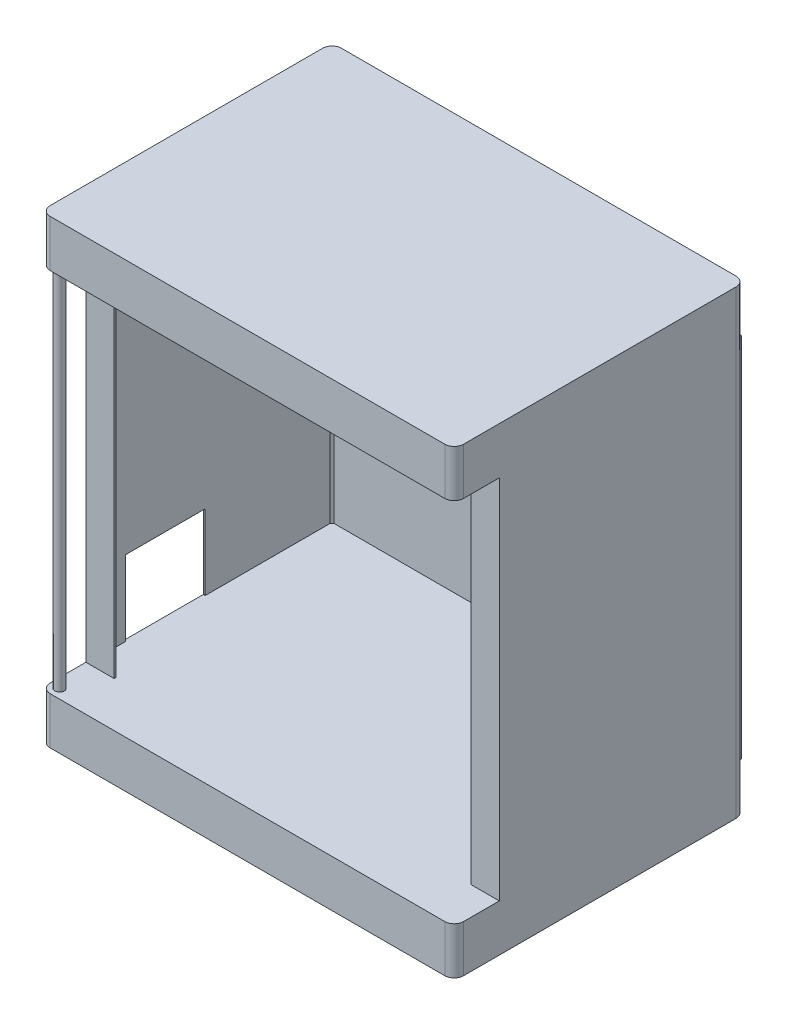
ISO-10303-21;
HEADER;
FILE_DESCRIPTION(('STEP AP214'),'2;1');
FILE_NAME('part.step','',(''),(''),'','','');
FILE_SCHEMA(('AUTOMOTIVE_DESIGN { 1 0 10303 214 1 1 1 1 }'));
ENDSEC;
DATA;
#1=APPLICATION_CONTEXT('core data for automotive mechanical design processes');
#2=APPLICATION_PROTOCOL_DEFINITION('international standard','automotive_design',2000,#1);
#3=PRODUCT_CONTEXT('',#1,'mechanical');
#4=PRODUCT('Part','Part','',(#3));
#5=PRODUCT_RELATED_PRODUCT_CATEGORY('part','',(#4));
#6=PRODUCT_DEFINITION_FORMATION('','',#4);
#7=PRODUCT_DEFINITION_CONTEXT('part definition',#1,'design');
#8=PRODUCT_DEFINITION('design','',#6,#7);
#9=PRODUCT_DEFINITION_SHAPE('','',#8);
#10=(LENGTH_UNIT() NAMED_UNIT(*) SI_UNIT(.MILLI.,.METRE.));
#11=(NAMED_UNIT(*) PLANE_ANGLE_UNIT() SI_UNIT($,.RADIAN.));
#12=(NAMED_UNIT(*) SI_UNIT($,.STERADIAN.) SOLID_ANGLE_UNIT());
#13=UNCERTAINTY_MEASURE_WITH_UNIT(LENGTH_MEASURE(1.E-05),#10,'distance_accuracy_value','');
#14=(GEOMETRIC_REPRESENTATION_CONTEXT(3) GLOBAL_UNCERTAINTY_ASSIGNED_CONTEXT((#13)) GLOBAL_UNIT_ASSIGNED_CONTEXT((#10,
#11,#12)) REPRESENTATION_CONTEXT('',''));
#15=CARTESIAN_POINT('',(0.,0.,0.));
#16=DIRECTION('',(0.,0.,1.));
#17=DIRECTION('',(1.,0.,0.));
#18=AXIS2_PLACEMENT_3D('',#15,#16,#17);
#19=CARTESIAN_POINT('',(0.,440.,0.));
#20=DIRECTION('',(0.,-1.,0.));
#21=DIRECTION('',(0.,0.,-1.));
#22=AXIS2_PLACEMENT_3D('',#19,#20,#21);
#23=PLANE('',#22);
#24=CARTESIAN_POINT('',(-210.,440.,145.));
#25=DIRECTION('',(0.,-1.,0.));
#26=DIRECTION('',(0.,0.,-1.));
#27=AXIS2_PLACEMENT_3D('',#24,#25,#26);
#28=CIRCLE('',#27,4.99999999999999);
#29=CARTESIAN_POINT('',(-210.,440.,140.));
#30=VERTEX_POINT('',#29);
#31=EDGE_CURVE('E225',#30,#30,#28,.F.);
#32=ORIENTED_EDGE('',*,*,#31,.T.);
#33=EDGE_LOOP('',(#32));
#34=FACE_BOUND('',#33,.T.);
#35=DIRECTION('',(1.,0.,0.));
#36=VECTOR('',#35,1.);
#37=CARTESIAN_POINT('',(0.,440.,155.));
#38=LINE('',#37,#36);
#39=CARTESIAN_POINT('',(-210.,440.,155.));
#40=VERTEX_POINT('',#39);
#41=CARTESIAN_POINT('',(210.,440.,155.));
#42=VERTEX_POINT('',#41);
#43=EDGE_CURVE('E326',#40,#42,#38,.T.);
#44=ORIENTED_EDGE('',*,*,#43,.F.);
#45=CARTESIAN_POINT('',(-210.,440.,145.));
#46=DIRECTION('',(0.,-1.,0.));
#47=DIRECTION('',(0.,0.,-1.));
#48=AXIS2_PLACEMENT_3D('',#45,#46,#47);
#49=CIRCLE('',#48,10.);
#50=CARTESIAN_POINT('',(-220.,440.,145.));
#51=VERTEX_POINT('',#50);
#52=EDGE_CURVE('E392',#40,#51,#49,.T.);
#53=ORIENTED_EDGE('',*,*,#52,.T.);
#54=DIRECTION('',(0.,0.,1.));
#55=VECTOR('',#54,1.);
#56=CARTESIAN_POINT('',(-220.,440.,105.));
#57=LINE('',#56,#55);
#58=CARTESIAN_POINT('',(-220.,440.,107.));
#59=VERTEX_POINT('',#58);
#60=EDGE_CURVE('E294',#59,#51,#57,.T.);
#61=ORIENTED_EDGE('',*,*,#60,.F.);
#62=DIRECTION('',(-1.,0.,0.));
#63=VECTOR('',#62,1.);
#64=CARTESIAN_POINT('',(-220.,440.,107.));
#65=LINE('',#64,#63);
#66=CARTESIAN_POINT('',(-190.,440.,107.));
#67=VERTEX_POINT('',#66);
#68=EDGE_CURVE('E280',#67,#59,#65,.T.);
#69=ORIENTED_EDGE('',*,*,#68,.F.);
#70=DIRECTION('',(0.,0.,-1.));
#71=VECTOR('',#70,1.);
#72=CARTESIAN_POINT('',(-190.,440.,107.));
#73=LINE('',#72,#71);
#74=CARTESIAN_POINT('',(-190.,440.,105.));
#75=VERTEX_POINT('',#74);
#76=EDGE_CURVE('E283',#67,#75,#73,.T.);
#77=ORIENTED_EDGE('',*,*,#76,.T.);
#78=DIRECTION('',(-1.,0.,0.));
#79=VECTOR('',#78,1.);
#80=CARTESIAN_POINT('',(-220.,440.,105.));
#81=LINE('',#80,#79);
#82=CARTESIAN_POINT('',(-218.,440.,105.));
#83=VERTEX_POINT('',#82);
#84=EDGE_CURVE('E274',#75,#83,#81,.T.);
#85=ORIENTED_EDGE('',*,*,#84,.T.);
#86=DIRECTION('',(0.,0.,1.));
#87=VECTOR('',#86,1.);
#88=CARTESIAN_POINT('',(-218.,440.,0.));
#89=LINE('',#88,#87);
#90=CARTESIAN_POINT('',(-218.,440.,-153.));
#91=VERTEX_POINT('',#90);
#92=EDGE_CURVE('E328',#91,#83,#89,.T.);
#93=ORIENTED_EDGE('',*,*,#92,.F.);
#94=DIRECTION('',(-1.,0.,0.));
#95=VECTOR('',#94,1.);
#96=CARTESIAN_POINT('',(0.,440.,-153.));
#97=LINE('',#96,#95);
#98=CARTESIAN_POINT('',(218.,440.,-153.));
#99=VERTEX_POINT('',#98);
#100=EDGE_CURVE('E320',#99,#91,#97,.T.);
#101=ORIENTED_EDGE('',*,*,#100,.F.);
#102=DIRECTION('',(0.,0.,-1.));
#103=VECTOR('',#102,1.);
#104=CARTESIAN_POINT('',(218.,440.,0.));
#105=LINE('',#104,#103);
#106=CARTESIAN_POINT('',(218.,440.,105.));
#107=VERTEX_POINT('',#106);
#108=EDGE_CURVE('E318',#107,#99,#105,.T.);
#109=ORIENTED_EDGE('',*,*,#108,.F.);
#110=DIRECTION('',(-1.,0.,0.));
#111=VECTOR('',#110,1.);
#112=CARTESIAN_POINT('',(220.,440.,105.));
#113=LINE('',#112,#111);
#114=CARTESIAN_POINT('',(190.,440.,105.));
#115=VERTEX_POINT('',#114);
#116=EDGE_CURVE('E245',#107,#115,#113,.T.);
#117=ORIENTED_EDGE('',*,*,#116,.T.);
#118=DIRECTION('',(0.,0.,-1.));
#119=VECTOR('',#118,1.);
#120=CARTESIAN_POINT('',(190.,440.,107.));
#121=LINE('',#120,#119);
#122=CARTESIAN_POINT('',(190.,440.,107.));
#123=VERTEX_POINT('',#122);
#124=EDGE_CURVE('E266',#123,#115,#121,.T.);
#125=ORIENTED_EDGE('',*,*,#124,.F.);
#126=DIRECTION('',(-1.,0.,0.));
#127=VECTOR('',#126,1.);
#128=CARTESIAN_POINT('',(220.,440.,107.));
#129=LINE('',#128,#127);
#130=CARTESIAN_POINT('',(220.,440.,107.));
#131=VERTEX_POINT('',#130);
#132=EDGE_CURVE('E249',#131,#123,#129,.T.);
#133=ORIENTED_EDGE('',*,*,#132,.F.);
#134=DIRECTION('',(0.,0.,1.));
#135=VECTOR('',#134,1.);
#136=CARTESIAN_POINT('',(220.,440.,105.));
#137=LINE('',#136,#135);
#138=CARTESIAN_POINT('',(220.,440.,145.));
#139=VERTEX_POINT('',#138);
#140=EDGE_CURVE('E298',#131,#139,#137,.T.);
#141=ORIENTED_EDGE('',*,*,#140,.T.);
#142=CARTESIAN_POINT('',(210.,440.,145.));
#143=DIRECTION('',(0.,-1.,0.));
#144=DIRECTION('',(0.,0.,-1.));
#145=AXIS2_PLACEMENT_3D('',#142,#143,#144);
#146=CIRCLE('',#145,10.);
#147=EDGE_CURVE('E390',#139,#42,#146,.T.);
#148=ORIENTED_EDGE('',*,*,#147,.T.);
#149=EDGE_LOOP('',(#44,#53,#61,#69,#77,#85,#93,#101,#109,#117,#125,#133,#141,#148));
#150=FACE_BOUND('',#149,.T.);
#151=ADVANCED_FACE('F35',(#34,#150),#23,.T.);
#152=CARTESIAN_POINT('',(0.,50.,0.));
#153=DIRECTION('',(0.,-1.,0.));
#154=DIRECTION('',(0.,0.,-1.));
#155=AXIS2_PLACEMENT_3D('',#152,#153,#154);
#156=PLANE('',#155);
#157=CARTESIAN_POINT('',(-210.,50.,145.));
#158=DIRECTION('',(0.,-1.,0.));
#159=DIRECTION('',(0.,0.,-1.));
#160=AXIS2_PLACEMENT_3D('',#157,#158,#159);
#161=CIRCLE('',#160,4.99999999999999);
#162=CARTESIAN_POINT('',(-210.,50.,140.));
#163=VERTEX_POINT('',#162);
#164=EDGE_CURVE('E348',#163,#163,#161,.F.);
#165=ORIENTED_EDGE('',*,*,#164,.F.);
#166=EDGE_LOOP('',(#165));
#167=FACE_BOUND('',#166,.T.);
#168=DIRECTION('',(1.,0.,0.));
#169=VECTOR('',#168,1.);
#170=CARTESIAN_POINT('',(0.,50.,155.));
#171=LINE('',#170,#169);
#172=CARTESIAN_POINT('',(-210.,50.,155.));
#173=VERTEX_POINT('',#172);
#174=CARTESIAN_POINT('',(210.,50.,155.));
#175=VERTEX_POINT('',#174);
#176=EDGE_CURVE('E321',#173,#175,#171,.T.);
#177=ORIENTED_EDGE('',*,*,#176,.T.);
#178=CARTESIAN_POINT('',(210.,50.,145.));
#179=DIRECTION('',(0.,-1.,0.));
#180=DIRECTION('',(0.,0.,-1.));
#181=AXIS2_PLACEMENT_3D('',#178,#179,#180);
#182=CIRCLE('',#181,10.);
#183=CARTESIAN_POINT('',(220.,50.,145.));
#184=VERTEX_POINT('',#183);
#185=EDGE_CURVE('E378',#175,#184,#182,.F.);
#186=ORIENTED_EDGE('',*,*,#185,.T.);
#187=DIRECTION('',(0.,0.,1.));
#188=VECTOR('',#187,1.);
#189=CARTESIAN_POINT('',(220.,50.,105.));
#190=LINE('',#189,#188);
#191=CARTESIAN_POINT('',(220.,50.,107.));
#192=VERTEX_POINT('',#191);
#193=EDGE_CURVE('E301',#192,#184,#190,.T.);
#194=ORIENTED_EDGE('',*,*,#193,.F.);
#195=DIRECTION('',(1.,0.,0.));
#196=VECTOR('',#195,1.);
#197=CARTESIAN_POINT('',(220.,50.,107.));
#198=LINE('',#197,#196);
#199=CARTESIAN_POINT('',(190.,50.,107.));
#200=VERTEX_POINT('',#199);
#201=EDGE_CURVE('E256',#200,#192,#198,.T.);
#202=ORIENTED_EDGE('',*,*,#201,.F.);
#203=DIRECTION('',(0.,0.,-1.));
#204=VECTOR('',#203,1.);
#205=CARTESIAN_POINT('',(190.,50.,107.));
#206=LINE('',#205,#204);
#207=CARTESIAN_POINT('',(190.,50.,105.));
#208=VERTEX_POINT('',#207);
#209=EDGE_CURVE('E259',#200,#208,#206,.T.);
#210=ORIENTED_EDGE('',*,*,#209,.T.);
#211=DIRECTION('',(1.,0.,0.));
#212=VECTOR('',#211,1.);
#213=CARTESIAN_POINT('',(220.,50.,105.));
#214=LINE('',#213,#212);
#215=CARTESIAN_POINT('',(218.,50.,105.));
#216=VERTEX_POINT('',#215);
#217=EDGE_CURVE('E250',#208,#216,#214,.T.);
#218=ORIENTED_EDGE('',*,*,#217,.T.);
#219=DIRECTION('',(0.,0.,-1.));
#220=VECTOR('',#219,1.);
#221=CARTESIAN_POINT('',(218.,50.,0.));
#222=LINE('',#221,#220);
#223=CARTESIAN_POINT('',(218.,50.,-153.));
#224=VERTEX_POINT('',#223);
#225=EDGE_CURVE('E310',#216,#224,#222,.T.);
#226=ORIENTED_EDGE('',*,*,#225,.T.);
#227=DIRECTION('',(-1.,0.,0.));
#228=VECTOR('',#227,1.);
#229=CARTESIAN_POINT('',(0.,50.,-153.));
#230=LINE('',#229,#228);
#231=CARTESIAN_POINT('',(-218.,50.,-153.));
#232=VERTEX_POINT('',#231);
#233=EDGE_CURVE('E312',#224,#232,#230,.T.);
#234=ORIENTED_EDGE('',*,*,#233,.T.);
#235=DIRECTION('',(0.,0.,1.));
#236=VECTOR('',#235,1.);
#237=CARTESIAN_POINT('',(-218.,50.,0.));
#238=LINE('',#237,#236);
#239=CARTESIAN_POINT('',(-218.,50.,-18.));
#240=VERTEX_POINT('',#239);
#241=EDGE_CURVE('E329',#232,#240,#238,.T.);
#242=ORIENTED_EDGE('',*,*,#241,.T.);
#243=DIRECTION('',(-1.,0.,0.));
#244=VECTOR('',#243,1.);
#245=CARTESIAN_POINT('',(220.001,50.,-18.));
#246=LINE('',#245,#244);
#247=CARTESIAN_POINT('',(-220.,50.,-18.));
#248=VERTEX_POINT('',#247);
#249=EDGE_CURVE('E221',#240,#248,#246,.T.);
#250=ORIENTED_EDGE('',*,*,#249,.T.);
#251=DIRECTION('',(0.,0.,1.));
#252=VECTOR('',#251,1.);
#253=CARTESIAN_POINT('',(-220.,50.,67.));
#254=LINE('',#253,#252);
#255=CARTESIAN_POINT('',(-220.,50.,67.));
#256=VERTEX_POINT('',#255);
#257=EDGE_CURVE('E217',#248,#256,#254,.T.);
#258=ORIENTED_EDGE('',*,*,#257,.T.);
#259=DIRECTION('',(-1.,0.,0.));
#260=VECTOR('',#259,1.);
#261=CARTESIAN_POINT('',(220.001,50.,67.));
#262=LINE('',#261,#260);
#263=CARTESIAN_POINT('',(-218.,50.,67.));
#264=VERTEX_POINT('',#263);
#265=EDGE_CURVE('E206',#264,#256,#262,.T.);
#266=ORIENTED_EDGE('',*,*,#265,.F.);
#267=CARTESIAN_POINT('',(-218.,50.,105.));
#268=VERTEX_POINT('',#267);
#269=EDGE_CURVE('E323',#264,#268,#238,.T.);
#270=ORIENTED_EDGE('',*,*,#269,.T.);
#271=DIRECTION('',(1.,0.,0.));
#272=VECTOR('',#271,1.);
#273=CARTESIAN_POINT('',(-220.,50.,105.));
#274=LINE('',#273,#272);
#275=CARTESIAN_POINT('',(-190.,50.,105.));
#276=VERTEX_POINT('',#275);
#277=EDGE_CURVE('E269',#268,#276,#274,.T.);
#278=ORIENTED_EDGE('',*,*,#277,.T.);
#279=DIRECTION('',(0.,0.,-1.));
#280=VECTOR('',#279,1.);
#281=CARTESIAN_POINT('',(-190.,50.,107.));
#282=LINE('',#281,#280);
#283=CARTESIAN_POINT('',(-190.,50.,107.));
#284=VERTEX_POINT('',#283);
#285=EDGE_CURVE('E290',#284,#276,#282,.T.);
#286=ORIENTED_EDGE('',*,*,#285,.F.);
#287=DIRECTION('',(1.,0.,0.));
#288=VECTOR('',#287,1.);
#289=CARTESIAN_POINT('',(-220.,50.,107.));
#290=LINE('',#289,#288);
#291=CARTESIAN_POINT('',(-220.,50.,107.));
#292=VERTEX_POINT('',#291);
#293=EDGE_CURVE('E273',#292,#284,#290,.T.);
#294=ORIENTED_EDGE('',*,*,#293,.F.);
#295=DIRECTION('',(0.,0.,1.));
#296=VECTOR('',#295,1.);
#297=CARTESIAN_POINT('',(-220.,50.,105.));
#298=LINE('',#297,#296);
#299=CARTESIAN_POINT('',(-220.,50.,145.));
#300=VERTEX_POINT('',#299);
#301=EDGE_CURVE('E293',#292,#300,#298,.T.);
#302=ORIENTED_EDGE('',*,*,#301,.T.);
#303=CARTESIAN_POINT('',(-210.,50.,145.));
#304=DIRECTION('',(0.,-1.,0.));
#305=DIRECTION('',(0.,0.,-1.));
#306=AXIS2_PLACEMENT_3D('',#303,#304,#305);
#307=CIRCLE('',#306,10.);
#308=EDGE_CURVE('E376',#300,#173,#307,.F.);
#309=ORIENTED_EDGE('',*,*,#308,.T.);
#310=EDGE_LOOP('',(#177,#186,#194,#202,#210,#218,#226,#234,#242,#250,#258,#266,#270,#278,#286,
#294,#302,#309));
#311=FACE_BOUND('',#310,.T.);
#312=ADVANCED_FACE('F219',(#167,#311),#156,.F.);
#313=CARTESIAN_POINT('',(-220.,490.,155.));
#314=DIRECTION('',(0.,0.,-1.));
#315=DIRECTION('',(-1.,0.,0.));
#316=AXIS2_PLACEMENT_3D('',#313,#314,#315);
#317=PLANE('',#316);
#318=DIRECTION('',(1.,0.,0.));
#319=VECTOR('',#318,1.);
#320=CARTESIAN_POINT('',(-220.,490.,155.));
#321=LINE('',#320,#319);
#322=CARTESIAN_POINT('',(-210.,490.,155.));
#323=VERTEX_POINT('',#322);
#324=CARTESIAN_POINT('',(210.,490.,155.));
#325=VERTEX_POINT('',#324);
#326=EDGE_CURVE('E345',#323,#325,#321,.T.);
#327=ORIENTED_EDGE('',*,*,#326,.F.);
#328=DIRECTION('',(0.,-1.,0.));
#329=VECTOR('',#328,1.);
#330=CARTESIAN_POINT('',(-210.,490.,155.));
#331=LINE('',#330,#329);
#332=EDGE_CURVE('E387',#323,#40,#331,.T.);
#333=ORIENTED_EDGE('',*,*,#332,.T.);
#334=ORIENTED_EDGE('',*,*,#43,.T.);
#335=DIRECTION('',(0.,-1.,0.));
#336=VECTOR('',#335,1.);
#337=CARTESIAN_POINT('',(210.,490.,155.));
#338=LINE('',#337,#336);
#339=EDGE_CURVE('E385',#42,#325,#338,.F.);
#340=ORIENTED_EDGE('',*,*,#339,.T.);
#341=EDGE_LOOP('',(#327,#333,#334,#340));
#342=FACE_BOUND('',#341,.T.);
#343=ADVANCED_FACE('F470',(#342),#317,.F.);
#344=CARTESIAN_POINT('',(218.,490.,155.));
#345=DIRECTION('',(-1.,0.,0.));
#346=DIRECTION('',(0.,0.,1.));
#347=AXIS2_PLACEMENT_3D('',#344,#345,#346);
#348=PLANE('',#347);
#349=ORIENTED_EDGE('',*,*,#225,.F.);
#350=DIRECTION('',(0.,1.,0.));
#351=VECTOR('',#350,1.);
#352=CARTESIAN_POINT('',(218.,490.,105.));
#353=LINE('',#352,#351);
#354=EDGE_CURVE('E308',#216,#107,#353,.T.);
#355=ORIENTED_EDGE('',*,*,#354,.T.);
#356=ORIENTED_EDGE('',*,*,#108,.T.);
#357=DIRECTION('',(0.,-1.,0.));
#358=VECTOR('',#357,1.);
#359=CARTESIAN_POINT('',(218.,490.,-153.));
#360=LINE('',#359,#358);
#361=EDGE_CURVE('E313',#99,#224,#360,.T.);
#362=ORIENTED_EDGE('',*,*,#361,.T.);
#363=EDGE_LOOP('',(#349,#355,#356,#362));
#364=FACE_BOUND('',#363,.T.);
#365=ADVANCED_FACE('F489',(#364),#348,.T.);
#366=CARTESIAN_POINT('',(-218.,490.,155.));
#367=DIRECTION('',(1.,0.,0.));
#368=DIRECTION('',(0.,0.,-1.));
#369=AXIS2_PLACEMENT_3D('',#366,#367,#368);
#370=PLANE('',#369);
#371=DIRECTION('',(0.,1.,0.));
#372=VECTOR('',#371,1.);
#373=CARTESIAN_POINT('',(-218.,50.,67.));
#374=LINE('',#373,#372);
#375=CARTESIAN_POINT('',(-218.,130.,67.));
#376=VERTEX_POINT('',#375);
#377=EDGE_CURVE('E210',#264,#376,#374,.T.);
#378=ORIENTED_EDGE('',*,*,#377,.T.);
#379=DIRECTION('',(0.,0.,-1.));
#380=VECTOR('',#379,1.);
#381=CARTESIAN_POINT('',(-218.,130.,67.));
#382=LINE('',#381,#380);
#383=CARTESIAN_POINT('',(-218.,130.,-18.));
#384=VERTEX_POINT('',#383);
#385=EDGE_CURVE('E234',#376,#384,#382,.T.);
#386=ORIENTED_EDGE('',*,*,#385,.T.);
#387=DIRECTION('',(0.,-1.,0.));
#388=VECTOR('',#387,1.);
#389=CARTESIAN_POINT('',(-218.,50.,-18.));
#390=LINE('',#389,#388);
#391=EDGE_CURVE('E213',#384,#240,#390,.T.);
#392=ORIENTED_EDGE('',*,*,#391,.T.);
#393=ORIENTED_EDGE('',*,*,#241,.F.);
#394=DIRECTION('',(0.,-1.,0.));
#395=VECTOR('',#394,1.);
#396=CARTESIAN_POINT('',(-218.,490.,-153.));
#397=LINE('',#396,#395);
#398=EDGE_CURVE('E317',#91,#232,#397,.T.);
#399=ORIENTED_EDGE('',*,*,#398,.F.);
#400=ORIENTED_EDGE('',*,*,#92,.T.);
#401=DIRECTION('',(0.,-1.,0.));
#402=VECTOR('',#401,1.);
#403=CARTESIAN_POINT('',(-218.,490.,105.));
#404=LINE('',#403,#402);
#405=EDGE_CURVE('E297',#83,#268,#404,.T.);
#406=ORIENTED_EDGE('',*,*,#405,.T.);
#407=ORIENTED_EDGE('',*,*,#269,.F.);
#408=EDGE_LOOP('',(#378,#386,#392,#393,#399,#400,#406,#407));
#409=FACE_BOUND('',#408,.T.);
#410=ADVANCED_FACE('F500',(#409),#370,.T.);
#411=DIRECTION('',(1.,0.,0.));
#412=VECTOR('',#411,1.);
#413=CARTESIAN_POINT('',(-220.,0.,155.));
#414=LINE('',#413,#412);
#415=CARTESIAN_POINT('',(-210.,0.,155.));
#416=VERTEX_POINT('',#415);
#417=CARTESIAN_POINT('',(210.,0.,155.));
#418=VERTEX_POINT('',#417);
#419=EDGE_CURVE('E340',#416,#418,#414,.T.);
#420=ORIENTED_EDGE('',*,*,#419,.T.);
#421=DIRECTION('',(0.,-1.,0.));
#422=VECTOR('',#421,1.);
#423=CARTESIAN_POINT('',(210.,490.,155.));
#424=LINE('',#423,#422);
#425=EDGE_CURVE('E374',#418,#175,#424,.F.);
#426=ORIENTED_EDGE('',*,*,#425,.T.);
#427=ORIENTED_EDGE('',*,*,#176,.F.);
#428=DIRECTION('',(0.,-1.,0.));
#429=VECTOR('',#428,1.);
#430=CARTESIAN_POINT('',(-210.,490.,155.));
#431=LINE('',#430,#429);
#432=EDGE_CURVE('E371',#173,#416,#431,.T.);
#433=ORIENTED_EDGE('',*,*,#432,.T.);
#434=EDGE_LOOP('',(#420,#426,#427,#433));
#435=FACE_BOUND('',#434,.T.);
#436=ADVANCED_FACE('F444',(#435),#317,.F.);
#437=CARTESIAN_POINT('',(220.,490.,155.));
#438=DIRECTION('',(-1.,0.,0.));
#439=DIRECTION('',(0.,0.,1.));
#440=AXIS2_PLACEMENT_3D('',#437,#438,#439);
#441=PLANE('',#440);
#442=DIRECTION('',(0.,0.,-1.));
#443=VECTOR('',#442,1.);
#444=CARTESIAN_POINT('',(220.,0.,155.));
#445=LINE('',#444,#443);
#446=CARTESIAN_POINT('',(220.,0.,145.));
#447=VERTEX_POINT('',#446);
#448=CARTESIAN_POINT('',(220.,0.,-145.));
#449=VERTEX_POINT('',#448);
#450=EDGE_CURVE('E316',#447,#449,#445,.T.);
#451=ORIENTED_EDGE('',*,*,#450,.T.);
#452=DIRECTION('',(0.,-1.,0.));
#453=VECTOR('',#452,1.);
#454=CARTESIAN_POINT('',(220.,490.,-145.));
#455=LINE('',#454,#453);
#456=CARTESIAN_POINT('',(220.,490.,-145.));
#457=VERTEX_POINT('',#456);
#458=EDGE_CURVE('E11',#449,#457,#455,.F.);
#459=ORIENTED_EDGE('',*,*,#458,.T.);
#460=DIRECTION('',(0.,0.,-1.));
#461=VECTOR('',#460,1.);
#462=CARTESIAN_POINT('',(220.,490.,155.));
#463=LINE('',#462,#461);
#464=CARTESIAN_POINT('',(220.,490.,145.));
#465=VERTEX_POINT('',#464);
#466=EDGE_CURVE('E336',#465,#457,#463,.T.);
#467=ORIENTED_EDGE('',*,*,#466,.F.);
#468=DIRECTION('',(0.,-1.,0.));
#469=VECTOR('',#468,1.);
#470=CARTESIAN_POINT('',(220.,490.,145.));
#471=LINE('',#470,#469);
#472=EDGE_CURVE('E360',#465,#139,#471,.T.);
#473=ORIENTED_EDGE('',*,*,#472,.T.);
#474=ORIENTED_EDGE('',*,*,#140,.F.);
#475=DIRECTION('',(0.,1.,0.));
#476=VECTOR('',#475,1.);
#477=CARTESIAN_POINT('',(220.,440.,107.));
#478=LINE('',#477,#476);
#479=EDGE_CURVE('E246',#192,#131,#478,.T.);
#480=ORIENTED_EDGE('',*,*,#479,.F.);
#481=ORIENTED_EDGE('',*,*,#193,.T.);
#482=DIRECTION('',(0.,-1.,0.));
#483=VECTOR('',#482,1.);
#484=CARTESIAN_POINT('',(220.,490.,145.));
#485=LINE('',#484,#483);
#486=EDGE_CURVE('E363',#184,#447,#485,.T.);
#487=ORIENTED_EDGE('',*,*,#486,.T.);
#488=EDGE_LOOP('',(#451,#459,#467,#473,#474,#480,#481,#487));
#489=FACE_BOUND('',#488,.T.);
#490=ADVANCED_FACE('F434',(#489),#441,.F.);
#491=CARTESIAN_POINT('',(-220.,490.,-155.));
#492=DIRECTION('',(0.,0.,1.));
#493=DIRECTION('',(1.,0.,0.));
#494=AXIS2_PLACEMENT_3D('',#491,#492,#493);
#495=PLANE('',#494);
#496=DIRECTION('',(-1.,0.,0.));
#497=VECTOR('',#496,1.);
#498=CARTESIAN_POINT('',(-220.,0.,-155.));
#499=LINE('',#498,#497);
#500=CARTESIAN_POINT('',(210.,0.,-155.));
#501=VERTEX_POINT('',#500);
#502=CARTESIAN_POINT('',(-210.,0.,-155.));
#503=VERTEX_POINT('',#502);
#504=EDGE_CURVE('E351',#501,#503,#499,.T.);
#505=ORIENTED_EDGE('',*,*,#504,.T.);
#506=DIRECTION('',(0.,-1.,0.));
#507=VECTOR('',#506,1.);
#508=CARTESIAN_POINT('',(-210.,490.,-155.));
#509=LINE('',#508,#507);
#510=CARTESIAN_POINT('',(-210.,490.,-155.));
#511=VERTEX_POINT('',#510);
#512=EDGE_CURVE('E408',#503,#511,#509,.F.);
#513=ORIENTED_EDGE('',*,*,#512,.T.);
#514=DIRECTION('',(-1.,0.,0.));
#515=VECTOR('',#514,1.);
#516=CARTESIAN_POINT('',(-220.,490.,-155.));
#517=LINE('',#516,#515);
#518=CARTESIAN_POINT('',(210.,490.,-155.));
#519=VERTEX_POINT('',#518);
#520=EDGE_CURVE('E339',#519,#511,#517,.T.);
#521=ORIENTED_EDGE('',*,*,#520,.F.);
#522=DIRECTION('',(0.,-1.,0.));
#523=VECTOR('',#522,1.);
#524=CARTESIAN_POINT('',(210.,490.,-155.));
#525=LINE('',#524,#523);
#526=EDGE_CURVE('E405',#519,#501,#525,.T.);
#527=ORIENTED_EDGE('',*,*,#526,.T.);
#528=EDGE_LOOP('',(#505,#513,#521,#527));
#529=FACE_BOUND('',#528,.T.);
#530=ADVANCED_FACE('F427',(#529),#495,.F.);
#531=CARTESIAN_POINT('',(-220.,490.,155.));
#532=DIRECTION('',(1.,0.,0.));
#533=DIRECTION('',(0.,0.,-1.));
#534=AXIS2_PLACEMENT_3D('',#531,#532,#533);
#535=PLANE('',#534);
#536=DIRECTION('',(0.,0.,-1.));
#537=VECTOR('',#536,1.);
#538=CARTESIAN_POINT('',(-220.,130.,67.));
#539=LINE('',#538,#537);
#540=CARTESIAN_POINT('',(-220.,130.,67.));
#541=VERTEX_POINT('',#540);
#542=CARTESIAN_POINT('',(-220.,130.,-18.));
#543=VERTEX_POINT('',#542);
#544=EDGE_CURVE('E231',#541,#543,#539,.T.);
#545=ORIENTED_EDGE('',*,*,#544,.F.);
#546=DIRECTION('',(0.,1.,0.));
#547=VECTOR('',#546,1.);
#548=CARTESIAN_POINT('',(-220.,50.,67.));
#549=LINE('',#548,#547);
#550=EDGE_CURVE('E58',#256,#541,#549,.T.);
#551=ORIENTED_EDGE('',*,*,#550,.F.);
#552=ORIENTED_EDGE('',*,*,#257,.F.);
#553=DIRECTION('',(0.,-1.,0.));
#554=VECTOR('',#553,1.);
#555=CARTESIAN_POINT('',(-220.,50.,-18.));
#556=LINE('',#555,#554);
#557=EDGE_CURVE('E226',#543,#248,#556,.T.);
#558=ORIENTED_EDGE('',*,*,#557,.F.);
#559=EDGE_LOOP('',(#545,#551,#552,#558));
#560=FACE_BOUND('',#559,.T.);
#561=DIRECTION('',(0.,0.,1.));
#562=VECTOR('',#561,1.);
#563=CARTESIAN_POINT('',(-220.,490.,155.));
#564=LINE('',#563,#562);
#565=CARTESIAN_POINT('',(-220.,490.,-145.));
#566=VERTEX_POINT('',#565);
#567=CARTESIAN_POINT('',(-220.,490.,145.));
#568=VERTEX_POINT('',#567);
#569=EDGE_CURVE('E343',#566,#568,#564,.T.);
#570=ORIENTED_EDGE('',*,*,#569,.F.);
#571=DIRECTION('',(0.,-1.,0.));
#572=VECTOR('',#571,1.);
#573=CARTESIAN_POINT('',(-220.,490.,-145.));
#574=LINE('',#573,#572);
#575=CARTESIAN_POINT('',(-220.,0.,-145.));
#576=VERTEX_POINT('',#575);
#577=EDGE_CURVE('E398',#566,#576,#574,.T.);
#578=ORIENTED_EDGE('',*,*,#577,.T.);
#579=DIRECTION('',(0.,0.,1.));
#580=VECTOR('',#579,1.);
#581=CARTESIAN_POINT('',(-220.,0.,155.));
#582=LINE('',#581,#580);
#583=CARTESIAN_POINT('',(-220.,0.,145.));
#584=VERTEX_POINT('',#583);
#585=EDGE_CURVE('E354',#576,#584,#582,.T.);
#586=ORIENTED_EDGE('',*,*,#585,.T.);
#587=DIRECTION('',(0.,-1.,0.));
#588=VECTOR('',#587,1.);
#589=CARTESIAN_POINT('',(-220.,490.,145.));
#590=LINE('',#589,#588);
#591=EDGE_CURVE('E383',#584,#300,#590,.F.);
#592=ORIENTED_EDGE('',*,*,#591,.T.);
#593=ORIENTED_EDGE('',*,*,#301,.F.);
#594=DIRECTION('',(0.,-1.,0.));
#595=VECTOR('',#594,1.);
#596=CARTESIAN_POINT('',(-220.,440.,107.));
#597=LINE('',#596,#595);
#598=EDGE_CURVE('E270',#59,#292,#597,.T.);
#599=ORIENTED_EDGE('',*,*,#598,.F.);
#600=ORIENTED_EDGE('',*,*,#60,.T.);
#601=DIRECTION('',(0.,-1.,0.));
#602=VECTOR('',#601,1.);
#603=CARTESIAN_POINT('',(-220.,490.,145.));
#604=LINE('',#603,#602);
#605=EDGE_CURVE('E380',#51,#568,#604,.F.);
#606=ORIENTED_EDGE('',*,*,#605,.T.);
#607=EDGE_LOOP('',(#570,#578,#586,#592,#593,#599,#600,#606));
#608=FACE_BOUND('',#607,.T.);
#609=ADVANCED_FACE('F229',(#560,#608),#535,.F.);
#610=CARTESIAN_POINT('',(0.,490.,0.));
#611=DIRECTION('',(0.,-1.,0.));
#612=DIRECTION('',(0.,0.,-1.));
#613=AXIS2_PLACEMENT_3D('',#610,#611,#612);
#614=PLANE('',#613);
#615=ORIENTED_EDGE('',*,*,#520,.T.);
#616=CARTESIAN_POINT('',(-210.,490.,-145.));
#617=DIRECTION('',(0.,-1.,0.));
#618=DIRECTION('',(0.,0.,-1.));
#619=AXIS2_PLACEMENT_3D('',#616,#617,#618);
#620=CIRCLE('',#619,10.);
#621=EDGE_CURVE('E43',#511,#566,#620,.F.);
#622=ORIENTED_EDGE('',*,*,#621,.T.);
#623=ORIENTED_EDGE('',*,*,#569,.T.);
#624=CARTESIAN_POINT('',(-210.,490.,145.));
#625=DIRECTION('',(0.,-1.,0.));
#626=DIRECTION('',(0.,0.,-1.));
#627=AXIS2_PLACEMENT_3D('',#624,#625,#626);
#628=CIRCLE('',#627,10.);
#629=EDGE_CURVE('E396',#568,#323,#628,.F.);
#630=ORIENTED_EDGE('',*,*,#629,.T.);
#631=ORIENTED_EDGE('',*,*,#326,.T.);
#632=CARTESIAN_POINT('',(210.,490.,145.));
#633=DIRECTION('',(0.,-1.,0.));
#634=DIRECTION('',(0.,0.,-1.));
#635=AXIS2_PLACEMENT_3D('',#632,#633,#634);
#636=CIRCLE('',#635,10.);
#637=EDGE_CURVE('E394',#325,#465,#636,.F.);
#638=ORIENTED_EDGE('',*,*,#637,.T.);
#639=ORIENTED_EDGE('',*,*,#466,.T.);
#640=CARTESIAN_POINT('',(210.,490.,-145.));
#641=DIRECTION('',(0.,-1.,0.));
#642=DIRECTION('',(0.,0.,-1.));
#643=AXIS2_PLACEMENT_3D('',#640,#641,#642);
#644=CIRCLE('',#643,10.);
#645=EDGE_CURVE('E410',#457,#519,#644,.F.);
#646=ORIENTED_EDGE('',*,*,#645,.T.);
#647=EDGE_LOOP('',(#615,#622,#623,#630,#631,#638,#639,#646));
#648=FACE_BOUND('',#647,.T.);
#649=ADVANCED_FACE('F414',(#648),#614,.F.);
#650=CARTESIAN_POINT('',(0.,0.,0.));
#651=DIRECTION('',(0.,-1.,0.));
#652=DIRECTION('',(0.,0.,-1.));
#653=AXIS2_PLACEMENT_3D('',#650,#651,#652);
#654=PLANE('',#653);
#655=ORIENTED_EDGE('',*,*,#585,.F.);
#656=CARTESIAN_POINT('',(-210.,0.,-145.));
#657=DIRECTION('',(0.,-1.,0.));
#658=DIRECTION('',(0.,0.,-1.));
#659=AXIS2_PLACEMENT_3D('',#656,#657,#658);
#660=CIRCLE('',#659,10.);
#661=EDGE_CURVE('E403',#576,#503,#660,.T.);
#662=ORIENTED_EDGE('',*,*,#661,.T.);
#663=ORIENTED_EDGE('',*,*,#504,.F.);
#664=CARTESIAN_POINT('',(210.,0.,-145.));
#665=DIRECTION('',(0.,-1.,0.));
#666=DIRECTION('',(0.,0.,-1.));
#667=AXIS2_PLACEMENT_3D('',#664,#665,#666);
#668=CIRCLE('',#667,10.);
#669=EDGE_CURVE('E401',#501,#449,#668,.T.);
#670=ORIENTED_EDGE('',*,*,#669,.T.);
#671=ORIENTED_EDGE('',*,*,#450,.F.);
#672=CARTESIAN_POINT('',(210.,0.,145.));
#673=DIRECTION('',(0.,-1.,0.));
#674=DIRECTION('',(0.,0.,-1.));
#675=AXIS2_PLACEMENT_3D('',#672,#673,#674);
#676=CIRCLE('',#675,10.);
#677=EDGE_CURVE('E369',#447,#418,#676,.T.);
#678=ORIENTED_EDGE('',*,*,#677,.T.);
#679=ORIENTED_EDGE('',*,*,#419,.F.);
#680=CARTESIAN_POINT('',(-210.,0.,145.));
#681=DIRECTION('',(0.,-1.,0.));
#682=DIRECTION('',(0.,0.,-1.));
#683=AXIS2_PLACEMENT_3D('',#680,#681,#682);
#684=CIRCLE('',#683,10.);
#685=EDGE_CURVE('E366',#416,#584,#684,.T.);
#686=ORIENTED_EDGE('',*,*,#685,.T.);
#687=EDGE_LOOP('',(#655,#662,#663,#670,#671,#678,#679,#686));
#688=FACE_BOUND('',#687,.T.);
#689=ADVANCED_FACE('F425',(#688),#654,.T.);
#690=CARTESIAN_POINT('',(-220.,490.,-153.));
#691=DIRECTION('',(0.,0.,1.));
#692=DIRECTION('',(1.,0.,0.));
#693=AXIS2_PLACEMENT_3D('',#690,#691,#692);
#694=PLANE('',#693);
#695=ORIENTED_EDGE('',*,*,#233,.F.);
#696=ORIENTED_EDGE('',*,*,#361,.F.);
#697=ORIENTED_EDGE('',*,*,#100,.T.);
#698=ORIENTED_EDGE('',*,*,#398,.T.);
#699=EDGE_LOOP('',(#695,#696,#697,#698));
#700=FACE_BOUND('',#699,.T.);
#701=ADVANCED_FACE('F497',(#700),#694,.T.);
#702=CARTESIAN_POINT('',(-190.,440.,107.));
#703=DIRECTION('',(-1.,0.,0.));
#704=DIRECTION('',(0.,-1.,0.));
#705=AXIS2_PLACEMENT_3D('',#702,#703,#704);
#706=PLANE('',#705);
#707=DIRECTION('',(0.,1.,0.));
#708=VECTOR('',#707,1.);
#709=CARTESIAN_POINT('',(-190.,440.,105.));
#710=LINE('',#709,#708);
#711=EDGE_CURVE('E285',#276,#75,#710,.T.);
#712=ORIENTED_EDGE('',*,*,#711,.T.);
#713=ORIENTED_EDGE('',*,*,#76,.F.);
#714=DIRECTION('',(0.,1.,0.));
#715=VECTOR('',#714,1.);
#716=CARTESIAN_POINT('',(-190.,440.,107.));
#717=LINE('',#716,#715);
#718=EDGE_CURVE('E277',#284,#67,#717,.T.);
#719=ORIENTED_EDGE('',*,*,#718,.F.);
#720=ORIENTED_EDGE('',*,*,#285,.T.);
#721=EDGE_LOOP('',(#712,#713,#719,#720));
#722=FACE_BOUND('',#721,.T.);
#723=ADVANCED_FACE('F458',(#722),#706,.F.);
#724=CARTESIAN_POINT('',(0.,0.,107.));
#725=DIRECTION('',(0.,0.,1.));
#726=DIRECTION('',(1.,0.,0.));
#727=AXIS2_PLACEMENT_3D('',#724,#725,#726);
#728=PLANE('',#727);
#729=ORIENTED_EDGE('',*,*,#598,.T.);
#730=ORIENTED_EDGE('',*,*,#293,.T.);
#731=ORIENTED_EDGE('',*,*,#718,.T.);
#732=ORIENTED_EDGE('',*,*,#68,.T.);
#733=EDGE_LOOP('',(#729,#730,#731,#732));
#734=FACE_BOUND('',#733,.T.);
#735=ADVANCED_FACE('F455',(#734),#728,.T.);
#736=CARTESIAN_POINT('',(0.,0.,105.));
#737=DIRECTION('',(0.,0.,1.));
#738=DIRECTION('',(1.,0.,0.));
#739=AXIS2_PLACEMENT_3D('',#736,#737,#738);
#740=PLANE('',#739);
#741=ORIENTED_EDGE('',*,*,#405,.F.);
#742=ORIENTED_EDGE('',*,*,#84,.F.);
#743=ORIENTED_EDGE('',*,*,#711,.F.);
#744=ORIENTED_EDGE('',*,*,#277,.F.);
#745=EDGE_LOOP('',(#741,#742,#743,#744));
#746=FACE_BOUND('',#745,.T.);
#747=ADVANCED_FACE('F509',(#746),#740,.F.);
#748=CARTESIAN_POINT('',(190.,440.,107.));
#749=DIRECTION('',(1.,0.,0.));
#750=DIRECTION('',(0.,1.,0.));
#751=AXIS2_PLACEMENT_3D('',#748,#749,#750);
#752=PLANE('',#751);
#753=DIRECTION('',(0.,-1.,0.));
#754=VECTOR('',#753,1.);
#755=CARTESIAN_POINT('',(190.,440.,105.));
#756=LINE('',#755,#754);
#757=EDGE_CURVE('E261',#115,#208,#756,.T.);
#758=ORIENTED_EDGE('',*,*,#757,.T.);
#759=ORIENTED_EDGE('',*,*,#209,.F.);
#760=DIRECTION('',(0.,-1.,0.));
#761=VECTOR('',#760,1.);
#762=CARTESIAN_POINT('',(190.,440.,107.));
#763=LINE('',#762,#761);
#764=EDGE_CURVE('E253',#123,#200,#763,.T.);
#765=ORIENTED_EDGE('',*,*,#764,.F.);
#766=ORIENTED_EDGE('',*,*,#124,.T.);
#767=EDGE_LOOP('',(#758,#759,#765,#766));
#768=FACE_BOUND('',#767,.T.);
#769=ADVANCED_FACE('F481',(#768),#752,.F.);
#770=CARTESIAN_POINT('',(0.,0.,107.));
#771=DIRECTION('',(0.,0.,-1.));
#772=DIRECTION('',(-1.,0.,0.));
#773=AXIS2_PLACEMENT_3D('',#770,#771,#772);
#774=PLANE('',#773);
#775=ORIENTED_EDGE('',*,*,#479,.T.);
#776=ORIENTED_EDGE('',*,*,#132,.T.);
#777=ORIENTED_EDGE('',*,*,#764,.T.);
#778=ORIENTED_EDGE('',*,*,#201,.T.);
#779=EDGE_LOOP('',(#775,#776,#777,#778));
#780=FACE_BOUND('',#779,.T.);
#781=ADVANCED_FACE('F478',(#780),#774,.F.);
#782=CARTESIAN_POINT('',(0.,0.,105.));
#783=DIRECTION('',(0.,0.,-1.));
#784=DIRECTION('',(-1.,0.,0.));
#785=AXIS2_PLACEMENT_3D('',#782,#783,#784);
#786=PLANE('',#785);
#787=ORIENTED_EDGE('',*,*,#116,.F.);
#788=ORIENTED_EDGE('',*,*,#354,.F.);
#789=ORIENTED_EDGE('',*,*,#217,.F.);
#790=ORIENTED_EDGE('',*,*,#757,.F.);
#791=EDGE_LOOP('',(#787,#788,#789,#790));
#792=FACE_BOUND('',#791,.T.);
#793=ADVANCED_FACE('F493',(#792),#786,.T.);
#794=CARTESIAN_POINT('',(-210.,504.142135623731,145.));
#795=DIRECTION('',(0.,-1.,0.));
#796=DIRECTION('',(0.,0.,-1.));
#797=AXIS2_PLACEMENT_3D('',#794,#795,#796);
#798=CYLINDRICAL_SURFACE('',#797,4.99999999999999);
#799=ORIENTED_EDGE('',*,*,#31,.F.);
#800=EDGE_LOOP('',(#799));
#801=FACE_BOUND('',#800,.T.);
#802=ORIENTED_EDGE('',*,*,#164,.T.);
#803=EDGE_LOOP('',(#802));
#804=FACE_BOUND('',#803,.T.);
#805=ADVANCED_FACE('F544',(#801,#804),#798,.T.);
#806=CARTESIAN_POINT('',(210.,490.,145.));
#807=DIRECTION('',(0.,-1.,0.));
#808=DIRECTION('',(0.,0.,-1.));
#809=AXIS2_PLACEMENT_3D('',#806,#807,#808);
#810=CYLINDRICAL_SURFACE('',#809,10.);
#811=ORIENTED_EDGE('',*,*,#185,.F.);
#812=ORIENTED_EDGE('',*,*,#425,.F.);
#813=ORIENTED_EDGE('',*,*,#677,.F.);
#814=ORIENTED_EDGE('',*,*,#486,.F.);
#815=EDGE_LOOP('',(#811,#812,#813,#814));
#816=FACE_BOUND('',#815,.T.);
#817=ADVANCED_FACE('F440',(#816),#810,.T.);
#818=CARTESIAN_POINT('',(-210.,490.,145.));
#819=DIRECTION('',(0.,-1.,0.));
#820=DIRECTION('',(0.,0.,-1.));
#821=AXIS2_PLACEMENT_3D('',#818,#819,#820);
#822=CYLINDRICAL_SURFACE('',#821,10.);
#823=ORIENTED_EDGE('',*,*,#308,.F.);
#824=ORIENTED_EDGE('',*,*,#591,.F.);
#825=ORIENTED_EDGE('',*,*,#685,.F.);
#826=ORIENTED_EDGE('',*,*,#432,.F.);
#827=EDGE_LOOP('',(#823,#824,#825,#826));
#828=FACE_BOUND('',#827,.T.);
#829=ADVANCED_FACE('F449',(#828),#822,.T.);
#830=CARTESIAN_POINT('',(-210.,490.,145.));
#831=DIRECTION('',(0.,-1.,0.));
#832=DIRECTION('',(0.,0.,-1.));
#833=AXIS2_PLACEMENT_3D('',#830,#831,#832);
#834=CYLINDRICAL_SURFACE('',#833,10.);
#835=ORIENTED_EDGE('',*,*,#629,.F.);
#836=ORIENTED_EDGE('',*,*,#605,.F.);
#837=ORIENTED_EDGE('',*,*,#52,.F.);
#838=ORIENTED_EDGE('',*,*,#332,.F.);
#839=EDGE_LOOP('',(#835,#836,#837,#838));
#840=FACE_BOUND('',#839,.T.);
#841=ADVANCED_FACE('F465',(#840),#834,.T.);
#842=CARTESIAN_POINT('',(210.,490.,145.));
#843=DIRECTION('',(0.,-1.,0.));
#844=DIRECTION('',(0.,0.,-1.));
#845=AXIS2_PLACEMENT_3D('',#842,#843,#844);
#846=CYLINDRICAL_SURFACE('',#845,10.);
#847=ORIENTED_EDGE('',*,*,#637,.F.);
#848=ORIENTED_EDGE('',*,*,#339,.F.);
#849=ORIENTED_EDGE('',*,*,#147,.F.);
#850=ORIENTED_EDGE('',*,*,#472,.F.);
#851=EDGE_LOOP('',(#847,#848,#849,#850));
#852=FACE_BOUND('',#851,.T.);
#853=ADVANCED_FACE('F473',(#852),#846,.T.);
#854=CARTESIAN_POINT('',(-210.,490.,-145.));
#855=DIRECTION('',(0.,-1.,0.));
#856=DIRECTION('',(0.,0.,-1.));
#857=AXIS2_PLACEMENT_3D('',#854,#855,#856);
#858=CYLINDRICAL_SURFACE('',#857,10.);
#859=ORIENTED_EDGE('',*,*,#621,.F.);
#860=ORIENTED_EDGE('',*,*,#512,.F.);
#861=ORIENTED_EDGE('',*,*,#661,.F.);
#862=ORIENTED_EDGE('',*,*,#577,.F.);
#863=EDGE_LOOP('',(#859,#860,#861,#862));
#864=FACE_BOUND('',#863,.T.);
#865=ADVANCED_FACE('F422',(#864),#858,.T.);
#866=CARTESIAN_POINT('',(210.,490.,-145.));
#867=DIRECTION('',(0.,-1.,0.));
#868=DIRECTION('',(0.,0.,-1.));
#869=AXIS2_PLACEMENT_3D('',#866,#867,#868);
#870=CYLINDRICAL_SURFACE('',#869,10.);
#871=ORIENTED_EDGE('',*,*,#645,.F.);
#872=ORIENTED_EDGE('',*,*,#458,.F.);
#873=ORIENTED_EDGE('',*,*,#669,.F.);
#874=ORIENTED_EDGE('',*,*,#526,.F.);
#875=EDGE_LOOP('',(#871,#872,#873,#874));
#876=FACE_BOUND('',#875,.T.);
#877=ADVANCED_FACE('F37',(#876),#870,.T.);
#878=CARTESIAN_POINT('',(220.001,50.,67.));
#879=DIRECTION('',(0.,0.,1.));
#880=DIRECTION('',(1.,0.,0.));
#881=AXIS2_PLACEMENT_3D('',#878,#879,#880);
#882=PLANE('',#881);
#883=ORIENTED_EDGE('',*,*,#265,.T.);
#884=ORIENTED_EDGE('',*,*,#550,.T.);
#885=DIRECTION('',(-1.,0.,0.));
#886=VECTOR('',#885,1.);
#887=CARTESIAN_POINT('',(220.001,130.,67.));
#888=LINE('',#887,#886);
#889=EDGE_CURVE('E214',#376,#541,#888,.T.);
#890=ORIENTED_EDGE('',*,*,#889,.F.);
#891=ORIENTED_EDGE('',*,*,#377,.F.);
#892=EDGE_LOOP('',(#883,#884,#890,#891));
#893=FACE_BOUND('',#892,.T.);
#894=ADVANCED_FACE('F208',(#893),#882,.F.);
#895=CARTESIAN_POINT('',(220.001,50.,-18.));
#896=DIRECTION('',(0.,0.,-1.));
#897=DIRECTION('',(-1.,0.,0.));
#898=AXIS2_PLACEMENT_3D('',#895,#896,#897);
#899=PLANE('',#898);
#900=DIRECTION('',(-1.,0.,0.));
#901=VECTOR('',#900,1.);
#902=CARTESIAN_POINT('',(220.001,130.,-18.));
#903=LINE('',#902,#901);
#904=EDGE_CURVE('E50',#384,#543,#903,.T.);
#905=ORIENTED_EDGE('',*,*,#904,.T.);
#906=ORIENTED_EDGE('',*,*,#557,.T.);
#907=ORIENTED_EDGE('',*,*,#249,.F.);
#908=ORIENTED_EDGE('',*,*,#391,.F.);
#909=EDGE_LOOP('',(#905,#906,#907,#908));
#910=FACE_BOUND('',#909,.T.);
#911=ADVANCED_FACE('F503',(#910),#899,.F.);
#912=CARTESIAN_POINT('',(220.001,130.,67.));
#913=DIRECTION('',(0.,1.,0.));
#914=DIRECTION('',(0.,0.,1.));
#915=AXIS2_PLACEMENT_3D('',#912,#913,#914);
#916=PLANE('',#915);
#917=ORIENTED_EDGE('',*,*,#889,.T.);
#918=ORIENTED_EDGE('',*,*,#544,.T.);
#919=ORIENTED_EDGE('',*,*,#904,.F.);
#920=ORIENTED_EDGE('',*,*,#385,.F.);
#921=EDGE_LOOP('',(#917,#918,#919,#920));
#922=FACE_BOUND('',#921,.T.);
#923=ADVANCED_FACE('F505',(#922),#916,.F.);
#924=CLOSED_SHELL('',(#151,#312,#343,#365,#410,#436,#490,#530,#609,#649,#689,#701,#723,#735,
#747,#769,#781,#793,#805,#817,#829,#841,#853,#865,#877,#894,#911,#923));
#925=MANIFOLD_SOLID_BREP('B2',#924);
#926=ADVANCED_BREP_SHAPE_REPRESENTATION('',(#18,#925),#14);
#927=SHAPE_DEFINITION_REPRESENTATION(#9,#926);
ENDSEC;
END-ISO-10303-21;
